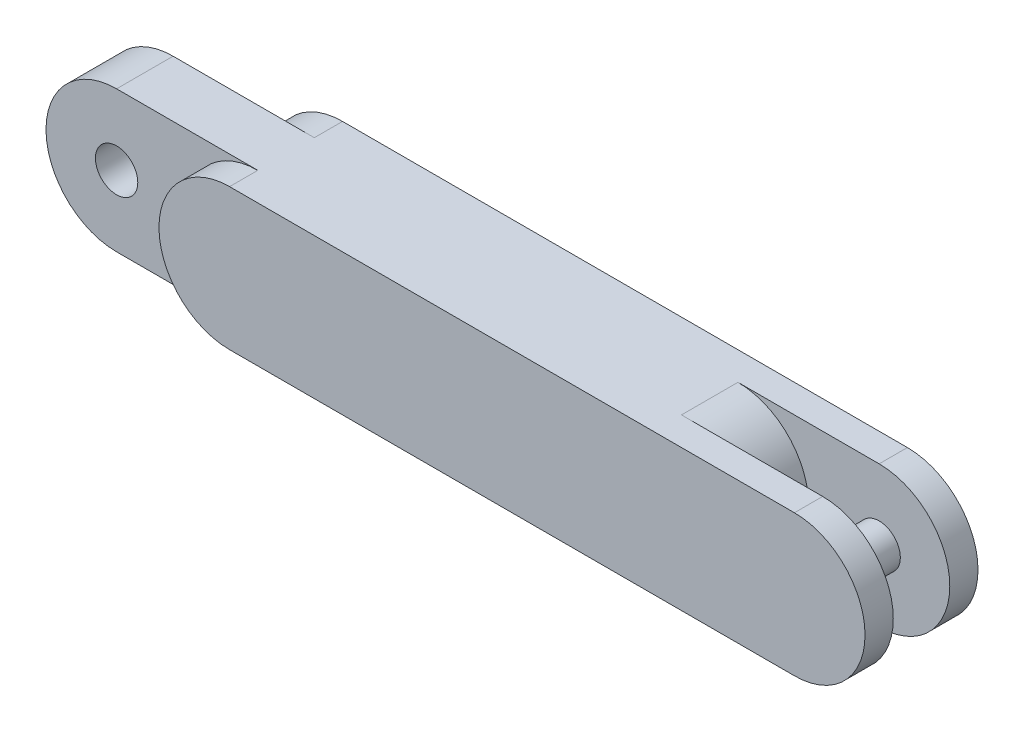
ISO-10303-21;
HEADER;
FILE_DESCRIPTION(('STEP AP214'),'2;1');
FILE_NAME('part.step','',(''),(''),'','','');
FILE_SCHEMA(('AUTOMOTIVE_DESIGN { 1 0 10303 214 1 1 1 1 }'));
ENDSEC;
DATA;
#1=APPLICATION_CONTEXT('core data for automotive mechanical design processes');
#2=APPLICATION_PROTOCOL_DEFINITION('international standard','automotive_design',2000,#1);
#3=PRODUCT_CONTEXT('',#1,'mechanical');
#4=PRODUCT('Part','Part','',(#3));
#5=PRODUCT_RELATED_PRODUCT_CATEGORY('part','',(#4));
#6=PRODUCT_DEFINITION_FORMATION('','',#4);
#7=PRODUCT_DEFINITION_CONTEXT('part definition',#1,'design');
#8=PRODUCT_DEFINITION('design','',#6,#7);
#9=PRODUCT_DEFINITION_SHAPE('','',#8);
#10=(LENGTH_UNIT() NAMED_UNIT(*) SI_UNIT(.MILLI.,.METRE.));
#11=(NAMED_UNIT(*) PLANE_ANGLE_UNIT() SI_UNIT($,.RADIAN.));
#12=(NAMED_UNIT(*) SI_UNIT($,.STERADIAN.) SOLID_ANGLE_UNIT());
#13=UNCERTAINTY_MEASURE_WITH_UNIT(LENGTH_MEASURE(1.E-05),#10,'distance_accuracy_value','');
#14=(GEOMETRIC_REPRESENTATION_CONTEXT(3) GLOBAL_UNCERTAINTY_ASSIGNED_CONTEXT((#13)) GLOBAL_UNIT_ASSIGNED_CONTEXT((#10,
#11,#12)) REPRESENTATION_CONTEXT('',''));
#15=CARTESIAN_POINT('',(0.,0.,0.));
#16=DIRECTION('',(0.,0.,1.));
#17=DIRECTION('',(1.,0.,0.));
#18=AXIS2_PLACEMENT_3D('',#15,#16,#17);
#19=CARTESIAN_POINT('',(-250.,-50.,40.));
#20=DIRECTION('',(0.,1.,0.));
#21=DIRECTION('',(-1.,0.,0.));
#22=AXIS2_PLACEMENT_3D('',#19,#20,#21);
#23=PLANE('',#22);
#24=DIRECTION('',(1.,0.,0.));
#25=VECTOR('',#24,1.);
#26=CARTESIAN_POINT('',(150.,-50.,-20.));
#27=LINE('',#26,#25);
#28=CARTESIAN_POINT('',(150.,-50.,-20.));
#29=VERTEX_POINT('',#28);
#30=CARTESIAN_POINT('',(250.,-50.,-20.));
#31=VERTEX_POINT('',#30);
#32=EDGE_CURVE('E142',#29,#31,#27,.T.);
#33=ORIENTED_EDGE('',*,*,#32,.F.);
#34=DIRECTION('',(0.,0.,1.));
#35=VECTOR('',#34,1.);
#36=CARTESIAN_POINT('',(150.,-50.,-20.));
#37=LINE('',#36,#35);
#38=CARTESIAN_POINT('',(150.,-50.,20.));
#39=VERTEX_POINT('',#38);
#40=EDGE_CURVE('E128',#29,#39,#37,.T.);
#41=ORIENTED_EDGE('',*,*,#40,.T.);
#42=DIRECTION('',(1.,0.,0.));
#43=VECTOR('',#42,1.);
#44=CARTESIAN_POINT('',(150.,-50.,20.));
#45=LINE('',#44,#43);
#46=CARTESIAN_POINT('',(250.,-50.,20.));
#47=VERTEX_POINT('',#46);
#48=EDGE_CURVE('E156',#39,#47,#45,.T.);
#49=ORIENTED_EDGE('',*,*,#48,.T.);
#50=DIRECTION('',(0.,0.,-1.));
#51=VECTOR('',#50,1.);
#52=CARTESIAN_POINT('',(250.,-50.,40.));
#53=LINE('',#52,#51);
#54=CARTESIAN_POINT('',(250.,-50.,40.));
#55=VERTEX_POINT('',#54);
#56=EDGE_CURVE('E223',#55,#47,#53,.T.);
#57=ORIENTED_EDGE('',*,*,#56,.F.);
#58=DIRECTION('',(1.,0.,0.));
#59=VECTOR('',#58,1.);
#60=CARTESIAN_POINT('',(-250.,-50.,40.));
#61=LINE('',#60,#59);
#62=CARTESIAN_POINT('',(-150.,-50.,40.));
#63=VERTEX_POINT('',#62);
#64=EDGE_CURVE('E202',#63,#55,#61,.T.);
#65=ORIENTED_EDGE('',*,*,#64,.F.);
#66=DIRECTION('',(0.,0.,1.));
#67=VECTOR('',#66,1.);
#68=CARTESIAN_POINT('',(-150.,-50.,20.));
#69=LINE('',#68,#67);
#70=CARTESIAN_POINT('',(-150.,-50.,20.));
#71=VERTEX_POINT('',#70);
#72=EDGE_CURVE('E197',#71,#63,#69,.T.);
#73=ORIENTED_EDGE('',*,*,#72,.F.);
#74=DIRECTION('',(1.,0.,0.));
#75=VECTOR('',#74,1.);
#76=CARTESIAN_POINT('',(-250.,-50.,20.));
#77=LINE('',#76,#75);
#78=CARTESIAN_POINT('',(-250.,-50.,20.));
#79=VERTEX_POINT('',#78);
#80=EDGE_CURVE('E192',#79,#71,#77,.T.);
#81=ORIENTED_EDGE('',*,*,#80,.F.);
#82=DIRECTION('',(0.,0.,-1.));
#83=VECTOR('',#82,1.);
#84=CARTESIAN_POINT('',(-250.,-50.,40.));
#85=LINE('',#84,#83);
#86=CARTESIAN_POINT('',(-250.,-50.,-20.));
#87=VERTEX_POINT('',#86);
#88=EDGE_CURVE('E45',#79,#87,#85,.T.);
#89=ORIENTED_EDGE('',*,*,#88,.T.);
#90=DIRECTION('',(-1.,0.,0.));
#91=VECTOR('',#90,1.);
#92=CARTESIAN_POINT('',(-150.,-50.,-20.));
#93=LINE('',#92,#91);
#94=CARTESIAN_POINT('',(-150.,-50.,-20.));
#95=VERTEX_POINT('',#94);
#96=EDGE_CURVE('E172',#95,#87,#93,.T.);
#97=ORIENTED_EDGE('',*,*,#96,.F.);
#98=DIRECTION('',(0.,0.,-1.));
#99=VECTOR('',#98,1.);
#100=CARTESIAN_POINT('',(-150.,-50.,-20.));
#101=LINE('',#100,#99);
#102=CARTESIAN_POINT('',(-150.,-50.,-40.));
#103=VERTEX_POINT('',#102);
#104=EDGE_CURVE('E179',#95,#103,#101,.T.);
#105=ORIENTED_EDGE('',*,*,#104,.T.);
#106=DIRECTION('',(1.,0.,0.));
#107=VECTOR('',#106,1.);
#108=CARTESIAN_POINT('',(-250.,-50.,-40.));
#109=LINE('',#108,#107);
#110=CARTESIAN_POINT('',(250.,-50.,-40.));
#111=VERTEX_POINT('',#110);
#112=EDGE_CURVE('E199',#103,#111,#109,.T.);
#113=ORIENTED_EDGE('',*,*,#112,.T.);
#114=EDGE_CURVE('E149',#31,#111,#53,.T.);
#115=ORIENTED_EDGE('',*,*,#114,.F.);
#116=EDGE_LOOP('',(#33,#41,#49,#57,#65,#73,#81,#89,#97,#105,#113,#115));
#117=FACE_BOUND('',#116,.T.);
#118=ADVANCED_FACE('F36',(#117),#23,.F.);
#119=CARTESIAN_POINT('',(-250.,50.,40.));
#120=DIRECTION('',(0.,-1.,0.));
#121=DIRECTION('',(1.,0.,0.));
#122=AXIS2_PLACEMENT_3D('',#119,#120,#121);
#123=PLANE('',#122);
#124=DIRECTION('',(-1.,0.,0.));
#125=VECTOR('',#124,1.);
#126=CARTESIAN_POINT('',(150.,50.,-20.));
#127=LINE('',#126,#125);
#128=CARTESIAN_POINT('',(250.,50.0000000000001,-20.));
#129=VERTEX_POINT('',#128);
#130=CARTESIAN_POINT('',(150.,50.,-20.));
#131=VERTEX_POINT('',#130);
#132=EDGE_CURVE('E138',#129,#131,#127,.T.);
#133=ORIENTED_EDGE('',*,*,#132,.F.);
#134=DIRECTION('',(0.,0.,-1.));
#135=VECTOR('',#134,1.);
#136=CARTESIAN_POINT('',(250.,50.0000000000001,40.));
#137=LINE('',#136,#135);
#138=CARTESIAN_POINT('',(250.,50.0000000000001,-40.));
#139=VERTEX_POINT('',#138);
#140=EDGE_CURVE('E219',#129,#139,#137,.T.);
#141=ORIENTED_EDGE('',*,*,#140,.T.);
#142=DIRECTION('',(-1.,0.,0.));
#143=VECTOR('',#142,1.);
#144=CARTESIAN_POINT('',(-250.,50.,-40.));
#145=LINE('',#144,#143);
#146=CARTESIAN_POINT('',(-150.,50.,-40.));
#147=VERTEX_POINT('',#146);
#148=EDGE_CURVE('E205',#139,#147,#145,.T.);
#149=ORIENTED_EDGE('',*,*,#148,.T.);
#150=DIRECTION('',(0.,0.,-1.));
#151=VECTOR('',#150,1.);
#152=CARTESIAN_POINT('',(-150.,50.,-20.));
#153=LINE('',#152,#151);
#154=CARTESIAN_POINT('',(-150.,50.,-20.));
#155=VERTEX_POINT('',#154);
#156=EDGE_CURVE('E61',#155,#147,#153,.T.);
#157=ORIENTED_EDGE('',*,*,#156,.F.);
#158=DIRECTION('',(1.,0.,0.));
#159=VECTOR('',#158,1.);
#160=CARTESIAN_POINT('',(-150.,50.,-20.));
#161=LINE('',#160,#159);
#162=CARTESIAN_POINT('',(-250.,50.,-20.));
#163=VERTEX_POINT('',#162);
#164=EDGE_CURVE('E176',#163,#155,#161,.T.);
#165=ORIENTED_EDGE('',*,*,#164,.F.);
#166=DIRECTION('',(0.,0.,-1.));
#167=VECTOR('',#166,1.);
#168=CARTESIAN_POINT('',(-250.,50.,40.));
#169=LINE('',#168,#167);
#170=CARTESIAN_POINT('',(-250.,50.,20.));
#171=VERTEX_POINT('',#170);
#172=EDGE_CURVE('E210',#171,#163,#169,.T.);
#173=ORIENTED_EDGE('',*,*,#172,.F.);
#174=DIRECTION('',(-1.,0.,0.));
#175=VECTOR('',#174,1.);
#176=CARTESIAN_POINT('',(-150.,50.,20.));
#177=LINE('',#176,#175);
#178=CARTESIAN_POINT('',(-150.,50.,20.));
#179=VERTEX_POINT('',#178);
#180=EDGE_CURVE('E188',#179,#171,#177,.T.);
#181=ORIENTED_EDGE('',*,*,#180,.F.);
#182=DIRECTION('',(0.,0.,1.));
#183=VECTOR('',#182,1.);
#184=CARTESIAN_POINT('',(-150.,50.,20.));
#185=LINE('',#184,#183);
#186=CARTESIAN_POINT('',(-150.,50.,40.));
#187=VERTEX_POINT('',#186);
#188=EDGE_CURVE('E195',#179,#187,#185,.T.);
#189=ORIENTED_EDGE('',*,*,#188,.T.);
#190=DIRECTION('',(-1.,0.,0.));
#191=VECTOR('',#190,1.);
#192=CARTESIAN_POINT('',(-250.,50.,40.));
#193=LINE('',#192,#191);
#194=CARTESIAN_POINT('',(250.,50.0000000000001,40.));
#195=VERTEX_POINT('',#194);
#196=EDGE_CURVE('E207',#195,#187,#193,.T.);
#197=ORIENTED_EDGE('',*,*,#196,.F.);
#198=CARTESIAN_POINT('',(250.,50.0000000000001,20.));
#199=VERTEX_POINT('',#198);
#200=EDGE_CURVE('E220',#195,#199,#137,.T.);
#201=ORIENTED_EDGE('',*,*,#200,.T.);
#202=DIRECTION('',(-1.,0.,0.));
#203=VECTOR('',#202,1.);
#204=CARTESIAN_POINT('',(150.,50.,20.));
#205=LINE('',#204,#203);
#206=CARTESIAN_POINT('',(150.,50.,20.));
#207=VERTEX_POINT('',#206);
#208=EDGE_CURVE('E53',#199,#207,#205,.T.);
#209=ORIENTED_EDGE('',*,*,#208,.T.);
#210=DIRECTION('',(0.,0.,1.));
#211=VECTOR('',#210,1.);
#212=CARTESIAN_POINT('',(150.,50.,-20.));
#213=LINE('',#212,#211);
#214=EDGE_CURVE('E137',#131,#207,#213,.T.);
#215=ORIENTED_EDGE('',*,*,#214,.F.);
#216=EDGE_LOOP('',(#133,#141,#149,#157,#165,#173,#181,#189,#197,#201,#209,#215));
#217=FACE_BOUND('',#216,.T.);
#218=ADVANCED_FACE('F238',(#217),#123,.F.);
#219=CARTESIAN_POINT('',(250.,0.,40.));
#220=DIRECTION('',(0.,0.,-1.));
#221=DIRECTION('',(-1.,0.,0.));
#222=AXIS2_PLACEMENT_3D('',#219,#220,#221);
#223=CYLINDRICAL_SURFACE('',#222,50.);
#224=CARTESIAN_POINT('',(250.,0.,-20.));
#225=DIRECTION('',(0.,0.,1.));
#226=DIRECTION('',(1.,0.,0.));
#227=AXIS2_PLACEMENT_3D('',#224,#225,#226);
#228=CIRCLE('',#227,50.);
#229=EDGE_CURVE('E150',#31,#129,#228,.T.);
#230=ORIENTED_EDGE('',*,*,#229,.F.);
#231=ORIENTED_EDGE('',*,*,#114,.T.);
#232=CARTESIAN_POINT('',(250.,0.,-40.));
#233=DIRECTION('',(0.,0.,1.));
#234=DIRECTION('',(1.,0.,0.));
#235=AXIS2_PLACEMENT_3D('',#232,#233,#234);
#236=CIRCLE('',#235,50.);
#237=EDGE_CURVE('E212',#111,#139,#236,.T.);
#238=ORIENTED_EDGE('',*,*,#237,.T.);
#239=ORIENTED_EDGE('',*,*,#140,.F.);
#240=EDGE_LOOP('',(#230,#231,#238,#239));
#241=FACE_BOUND('',#240,.T.);
#242=ADVANCED_FACE('F264',(#241),#223,.T.);
#243=CARTESIAN_POINT('',(-250.,0.,40.));
#244=DIRECTION('',(0.,0.,-1.));
#245=DIRECTION('',(-1.,0.,0.));
#246=AXIS2_PLACEMENT_3D('',#243,#244,#245);
#247=CYLINDRICAL_SURFACE('',#246,50.);
#248=CARTESIAN_POINT('',(-250.,0.,-20.));
#249=DIRECTION('',(0.,0.,-1.));
#250=DIRECTION('',(-1.,0.,0.));
#251=AXIS2_PLACEMENT_3D('',#248,#249,#250);
#252=CIRCLE('',#251,50.);
#253=EDGE_CURVE('E174',#87,#163,#252,.T.);
#254=ORIENTED_EDGE('',*,*,#253,.F.);
#255=ORIENTED_EDGE('',*,*,#88,.F.);
#256=CARTESIAN_POINT('',(-250.,0.,20.));
#257=DIRECTION('',(0.,0.,1.));
#258=DIRECTION('',(1.,0.,0.));
#259=AXIS2_PLACEMENT_3D('',#256,#257,#258);
#260=CIRCLE('',#259,50.);
#261=EDGE_CURVE('E190',#171,#79,#260,.T.);
#262=ORIENTED_EDGE('',*,*,#261,.F.);
#263=ORIENTED_EDGE('',*,*,#172,.T.);
#264=EDGE_LOOP('',(#254,#255,#262,#263));
#265=FACE_BOUND('',#264,.T.);
#266=ADVANCED_FACE('F38',(#265),#247,.T.);
#267=ORIENTED_EDGE('',*,*,#56,.T.);
#268=CARTESIAN_POINT('',(250.,0.,20.));
#269=DIRECTION('',(0.,0.,1.));
#270=DIRECTION('',(1.,0.,0.));
#271=AXIS2_PLACEMENT_3D('',#268,#269,#270);
#272=CIRCLE('',#271,50.);
#273=EDGE_CURVE('E158',#47,#199,#272,.T.);
#274=ORIENTED_EDGE('',*,*,#273,.T.);
#275=ORIENTED_EDGE('',*,*,#200,.F.);
#276=CARTESIAN_POINT('',(250.,0.,40.));
#277=DIRECTION('',(0.,0.,1.));
#278=DIRECTION('',(1.,0.,0.));
#279=AXIS2_PLACEMENT_3D('',#276,#277,#278);
#280=CIRCLE('',#279,50.);
#281=EDGE_CURVE('E204',#55,#195,#280,.T.);
#282=ORIENTED_EDGE('',*,*,#281,.F.);
#283=EDGE_LOOP('',(#267,#274,#275,#282));
#284=FACE_BOUND('',#283,.T.);
#285=ADVANCED_FACE('F267',(#284),#223,.T.);
#286=CARTESIAN_POINT('',(-250.,0.,40.));
#287=DIRECTION('',(0.,0.,1.));
#288=DIRECTION('',(1.,0.,0.));
#289=AXIS2_PLACEMENT_3D('',#286,#287,#288);
#290=PLANE('',#289);
#291=CARTESIAN_POINT('',(-150.,0.,40.));
#292=DIRECTION('',(0.,0.,-1.));
#293=DIRECTION('',(1.,0.,0.));
#294=AXIS2_PLACEMENT_3D('',#291,#292,#293);
#295=CIRCLE('',#294,50.);
#296=EDGE_CURVE('E182',#63,#187,#295,.T.);
#297=ORIENTED_EDGE('',*,*,#296,.F.);
#298=ORIENTED_EDGE('',*,*,#64,.T.);
#299=ORIENTED_EDGE('',*,*,#281,.T.);
#300=ORIENTED_EDGE('',*,*,#196,.T.);
#301=EDGE_LOOP('',(#297,#298,#299,#300));
#302=FACE_BOUND('',#301,.T.);
#303=ADVANCED_FACE('F269',(#302),#290,.T.);
#304=CARTESIAN_POINT('',(-250.,0.,-40.));
#305=DIRECTION('',(0.,0.,1.));
#306=DIRECTION('',(1.,0.,0.));
#307=AXIS2_PLACEMENT_3D('',#304,#305,#306);
#308=PLANE('',#307);
#309=ORIENTED_EDGE('',*,*,#112,.F.);
#310=CARTESIAN_POINT('',(-150.,0.,-40.));
#311=DIRECTION('',(0.,0.,1.));
#312=DIRECTION('',(-1.,0.,0.));
#313=AXIS2_PLACEMENT_3D('',#310,#311,#312);
#314=CIRCLE('',#313,50.);
#315=EDGE_CURVE('E166',#147,#103,#314,.T.);
#316=ORIENTED_EDGE('',*,*,#315,.F.);
#317=ORIENTED_EDGE('',*,*,#148,.F.);
#318=ORIENTED_EDGE('',*,*,#237,.F.);
#319=EDGE_LOOP('',(#309,#316,#317,#318));
#320=FACE_BOUND('',#319,.T.);
#321=ADVANCED_FACE('F245',(#320),#308,.F.);
#322=CARTESIAN_POINT('',(-150.,0.,20.));
#323=DIRECTION('',(0.,0.,1.));
#324=DIRECTION('',(1.,0.,0.));
#325=AXIS2_PLACEMENT_3D('',#322,#323,#324);
#326=CYLINDRICAL_SURFACE('',#325,50.);
#327=ORIENTED_EDGE('',*,*,#296,.T.);
#328=ORIENTED_EDGE('',*,*,#188,.F.);
#329=CARTESIAN_POINT('',(-150.,0.,20.));
#330=DIRECTION('',(0.,0.,-1.));
#331=DIRECTION('',(1.,0.,0.));
#332=AXIS2_PLACEMENT_3D('',#329,#330,#331);
#333=CIRCLE('',#332,50.);
#334=EDGE_CURVE('E185',#71,#179,#333,.T.);
#335=ORIENTED_EDGE('',*,*,#334,.F.);
#336=ORIENTED_EDGE('',*,*,#72,.T.);
#337=EDGE_LOOP('',(#327,#328,#335,#336));
#338=FACE_BOUND('',#337,.T.);
#339=ADVANCED_FACE('F257',(#338),#326,.T.);
#340=CARTESIAN_POINT('',(-150.,0.,20.));
#341=DIRECTION('',(0.,0.,1.));
#342=DIRECTION('',(1.,0.,0.));
#343=AXIS2_PLACEMENT_3D('',#340,#341,#342);
#344=PLANE('',#343);
#345=CARTESIAN_POINT('',(-250.,0.,20.));
#346=DIRECTION('',(0.,0.,1.));
#347=DIRECTION('',(1.,0.,0.));
#348=AXIS2_PLACEMENT_3D('',#345,#346,#347);
#349=CIRCLE('',#348,15.);
#350=CARTESIAN_POINT('',(-235.,0.,20.));
#351=VERTEX_POINT('',#350);
#352=EDGE_CURVE('E161',#351,#351,#349,.T.);
#353=ORIENTED_EDGE('',*,*,#352,.F.);
#354=EDGE_LOOP('',(#353));
#355=FACE_BOUND('',#354,.T.);
#356=ORIENTED_EDGE('',*,*,#334,.T.);
#357=ORIENTED_EDGE('',*,*,#180,.T.);
#358=ORIENTED_EDGE('',*,*,#261,.T.);
#359=ORIENTED_EDGE('',*,*,#80,.T.);
#360=EDGE_LOOP('',(#356,#357,#358,#359));
#361=FACE_BOUND('',#360,.T.);
#362=ADVANCED_FACE('F248',(#355,#361),#344,.T.);
#363=CARTESIAN_POINT('',(-150.,0.,-20.));
#364=DIRECTION('',(0.,0.,-1.));
#365=DIRECTION('',(-1.,0.,0.));
#366=AXIS2_PLACEMENT_3D('',#363,#364,#365);
#367=CYLINDRICAL_SURFACE('',#366,50.);
#368=ORIENTED_EDGE('',*,*,#315,.T.);
#369=ORIENTED_EDGE('',*,*,#104,.F.);
#370=CARTESIAN_POINT('',(-150.,0.,-20.));
#371=DIRECTION('',(0.,0.,1.));
#372=DIRECTION('',(-1.,0.,0.));
#373=AXIS2_PLACEMENT_3D('',#370,#371,#372);
#374=CIRCLE('',#373,50.);
#375=EDGE_CURVE('E169',#155,#95,#374,.T.);
#376=ORIENTED_EDGE('',*,*,#375,.F.);
#377=ORIENTED_EDGE('',*,*,#156,.T.);
#378=EDGE_LOOP('',(#368,#369,#376,#377));
#379=FACE_BOUND('',#378,.T.);
#380=ADVANCED_FACE('F246',(#379),#367,.T.);
#381=CARTESIAN_POINT('',(-150.,0.,-20.));
#382=DIRECTION('',(0.,0.,-1.));
#383=DIRECTION('',(-1.,0.,0.));
#384=AXIS2_PLACEMENT_3D('',#381,#382,#383);
#385=PLANE('',#384);
#386=CARTESIAN_POINT('',(-250.,0.,-20.));
#387=DIRECTION('',(0.,0.,1.));
#388=DIRECTION('',(1.,0.,0.));
#389=AXIS2_PLACEMENT_3D('',#386,#387,#388);
#390=CIRCLE('',#389,15.);
#391=CARTESIAN_POINT('',(-235.,0.,-20.));
#392=VERTEX_POINT('',#391);
#393=EDGE_CURVE('E163',#392,#392,#390,.T.);
#394=ORIENTED_EDGE('',*,*,#393,.T.);
#395=EDGE_LOOP('',(#394));
#396=FACE_BOUND('',#395,.T.);
#397=ORIENTED_EDGE('',*,*,#375,.T.);
#398=ORIENTED_EDGE('',*,*,#96,.T.);
#399=ORIENTED_EDGE('',*,*,#253,.T.);
#400=ORIENTED_EDGE('',*,*,#164,.T.);
#401=EDGE_LOOP('',(#397,#398,#399,#400));
#402=FACE_BOUND('',#401,.T.);
#403=ADVANCED_FACE('F236',(#396,#402),#385,.T.);
#404=CARTESIAN_POINT('',(-250.,0.,-20.));
#405=DIRECTION('',(0.,0.,1.));
#406=DIRECTION('',(1.,0.,0.));
#407=AXIS2_PLACEMENT_3D('',#404,#405,#406);
#408=CYLINDRICAL_SURFACE('',#407,15.);
#409=ORIENTED_EDGE('',*,*,#393,.F.);
#410=EDGE_LOOP('',(#409));
#411=FACE_BOUND('',#410,.T.);
#412=ORIENTED_EDGE('',*,*,#352,.T.);
#413=EDGE_LOOP('',(#412));
#414=FACE_BOUND('',#413,.T.);
#415=ADVANCED_FACE('F254',(#411,#414),#408,.F.);
#416=CARTESIAN_POINT('',(150.,0.,-20.));
#417=DIRECTION('',(0.,0.,1.));
#418=DIRECTION('',(1.,0.,0.));
#419=AXIS2_PLACEMENT_3D('',#416,#417,#418);
#420=CYLINDRICAL_SURFACE('',#419,50.);
#421=CARTESIAN_POINT('',(150.,0.,20.));
#422=DIRECTION('',(0.,0.,-1.));
#423=DIRECTION('',(1.,0.,0.));
#424=AXIS2_PLACEMENT_3D('',#421,#422,#423);
#425=CIRCLE('',#424,50.);
#426=EDGE_CURVE('E133',#207,#39,#425,.T.);
#427=ORIENTED_EDGE('',*,*,#426,.T.);
#428=ORIENTED_EDGE('',*,*,#40,.F.);
#429=CARTESIAN_POINT('',(150.,0.,-20.));
#430=DIRECTION('',(0.,0.,-1.));
#431=DIRECTION('',(1.,0.,0.));
#432=AXIS2_PLACEMENT_3D('',#429,#430,#431);
#433=CIRCLE('',#432,50.);
#434=EDGE_CURVE('E131',#131,#29,#433,.T.);
#435=ORIENTED_EDGE('',*,*,#434,.F.);
#436=ORIENTED_EDGE('',*,*,#214,.T.);
#437=EDGE_LOOP('',(#427,#428,#435,#436));
#438=FACE_BOUND('',#437,.T.);
#439=ADVANCED_FACE('F130',(#438),#420,.T.);
#440=CARTESIAN_POINT('',(150.,0.,-20.));
#441=DIRECTION('',(0.,0.,1.));
#442=DIRECTION('',(1.,0.,0.));
#443=AXIS2_PLACEMENT_3D('',#440,#441,#442);
#444=PLANE('',#443);
#445=CARTESIAN_POINT('',(250.,0.,-20.));
#446=DIRECTION('',(0.,0.,1.));
#447=DIRECTION('',(1.,0.,0.));
#448=AXIS2_PLACEMENT_3D('',#445,#446,#447);
#449=CIRCLE('',#448,15.);
#450=CARTESIAN_POINT('',(265.,0.,-20.));
#451=VERTEX_POINT('',#450);
#452=EDGE_CURVE('E11',#451,#451,#449,.T.);
#453=ORIENTED_EDGE('',*,*,#452,.F.);
#454=EDGE_LOOP('',(#453));
#455=FACE_BOUND('',#454,.T.);
#456=ORIENTED_EDGE('',*,*,#434,.T.);
#457=ORIENTED_EDGE('',*,*,#32,.T.);
#458=ORIENTED_EDGE('',*,*,#229,.T.);
#459=ORIENTED_EDGE('',*,*,#132,.T.);
#460=EDGE_LOOP('',(#456,#457,#458,#459));
#461=FACE_BOUND('',#460,.T.);
#462=ADVANCED_FACE('F141',(#455,#461),#444,.T.);
#463=CARTESIAN_POINT('',(150.,0.,20.));
#464=DIRECTION('',(0.,0.,1.));
#465=DIRECTION('',(1.,0.,0.));
#466=AXIS2_PLACEMENT_3D('',#463,#464,#465);
#467=PLANE('',#466);
#468=CARTESIAN_POINT('',(250.,0.,20.));
#469=DIRECTION('',(0.,0.,1.));
#470=DIRECTION('',(1.,0.,0.));
#471=AXIS2_PLACEMENT_3D('',#468,#469,#470);
#472=CIRCLE('',#471,15.);
#473=CARTESIAN_POINT('',(265.,0.,20.));
#474=VERTEX_POINT('',#473);
#475=EDGE_CURVE('E40',#474,#474,#472,.T.);
#476=ORIENTED_EDGE('',*,*,#475,.T.);
#477=EDGE_LOOP('',(#476));
#478=FACE_BOUND('',#477,.T.);
#479=ORIENTED_EDGE('',*,*,#426,.F.);
#480=ORIENTED_EDGE('',*,*,#208,.F.);
#481=ORIENTED_EDGE('',*,*,#273,.F.);
#482=ORIENTED_EDGE('',*,*,#48,.F.);
#483=EDGE_LOOP('',(#479,#480,#481,#482));
#484=FACE_BOUND('',#483,.T.);
#485=ADVANCED_FACE('F287',(#478,#484),#467,.F.);
#486=CARTESIAN_POINT('',(250.,0.,-40.));
#487=DIRECTION('',(0.,0.,1.));
#488=DIRECTION('',(1.,0.,0.));
#489=AXIS2_PLACEMENT_3D('',#486,#487,#488);
#490=CYLINDRICAL_SURFACE('',#489,15.);
#491=ORIENTED_EDGE('',*,*,#452,.T.);
#492=EDGE_LOOP('',(#491));
#493=FACE_BOUND('',#492,.T.);
#494=ORIENTED_EDGE('',*,*,#475,.F.);
#495=EDGE_LOOP('',(#494));
#496=FACE_BOUND('',#495,.T.);
#497=ADVANCED_FACE('F289',(#493,#496),#490,.T.);
#498=CLOSED_SHELL('',(#118,#218,#242,#266,#285,#303,#321,#339,#362,#380,#403,#415,#439,#462,
#485,#497));
#499=MANIFOLD_SOLID_BREP('B2',#498);
#500=ADVANCED_BREP_SHAPE_REPRESENTATION('',(#18,#499),#14);
#501=SHAPE_DEFINITION_REPRESENTATION(#9,#500);
ENDSEC;
END-ISO-10303-21;
